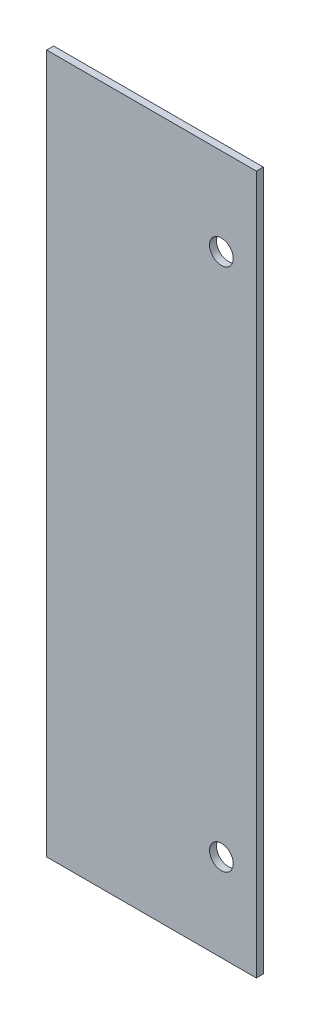
ISO-10303-21;
HEADER;
FILE_DESCRIPTION(('STEP AP214'),'2;1');
FILE_NAME('part.step','',(''),(''),'','','');
FILE_SCHEMA(('AUTOMOTIVE_DESIGN { 1 0 10303 214 1 1 1 1 }'));
ENDSEC;
DATA;
#1=APPLICATION_CONTEXT('core data for automotive mechanical design processes');
#2=APPLICATION_PROTOCOL_DEFINITION('international standard','automotive_design',2000,#1);
#3=PRODUCT_CONTEXT('',#1,'mechanical');
#4=PRODUCT('Part','Part','',(#3));
#5=PRODUCT_RELATED_PRODUCT_CATEGORY('part','',(#4));
#6=PRODUCT_DEFINITION_FORMATION('','',#4);
#7=PRODUCT_DEFINITION_CONTEXT('part definition',#1,'design');
#8=PRODUCT_DEFINITION('design','',#6,#7);
#9=PRODUCT_DEFINITION_SHAPE('','',#8);
#10=(LENGTH_UNIT() NAMED_UNIT(*) SI_UNIT(.MILLI.,.METRE.));
#11=(NAMED_UNIT(*) PLANE_ANGLE_UNIT() SI_UNIT($,.RADIAN.));
#12=(NAMED_UNIT(*) SI_UNIT($,.STERADIAN.) SOLID_ANGLE_UNIT());
#13=UNCERTAINTY_MEASURE_WITH_UNIT(LENGTH_MEASURE(1.E-05),#10,'distance_accuracy_value','');
#14=(GEOMETRIC_REPRESENTATION_CONTEXT(3) GLOBAL_UNCERTAINTY_ASSIGNED_CONTEXT((#13)) GLOBAL_UNIT_ASSIGNED_CONTEXT((#10,
#11,#12)) REPRESENTATION_CONTEXT('',''));
#15=CARTESIAN_POINT('',(0.,0.,0.));
#16=DIRECTION('',(0.,0.,1.));
#17=DIRECTION('',(1.,0.,0.));
#18=AXIS2_PLACEMENT_3D('',#15,#16,#17);
#19=CARTESIAN_POINT('',(0.,0.,0.));
#20=DIRECTION('',(0.,0.,-1.));
#21=DIRECTION('',(-1.,0.,0.));
#22=AXIS2_PLACEMENT_3D('',#19,#20,#21);
#23=PLANE('',#22);
#24=DIRECTION('',(0.,1.,0.));
#25=VECTOR('',#24,1.);
#26=CARTESIAN_POINT('',(15.,-50.,0.));
#27=LINE('',#26,#25);
#28=CARTESIAN_POINT('',(15.,-50.,0.));
#29=VERTEX_POINT('',#28);
#30=CARTESIAN_POINT('',(15.,50.,0.));
#31=VERTEX_POINT('',#30);
#32=EDGE_CURVE('E108',#29,#31,#27,.T.);
#33=ORIENTED_EDGE('',*,*,#32,.T.);
#34=DIRECTION('',(-1.,0.,0.));
#35=VECTOR('',#34,1.);
#36=CARTESIAN_POINT('',(-15.,50.,0.));
#37=LINE('',#36,#35);
#38=CARTESIAN_POINT('',(-15.,50.,0.));
#39=VERTEX_POINT('',#38);
#40=EDGE_CURVE('E115',#31,#39,#37,.T.);
#41=ORIENTED_EDGE('',*,*,#40,.T.);
#42=DIRECTION('',(0.,-1.,0.));
#43=VECTOR('',#42,1.);
#44=CARTESIAN_POINT('',(-15.,-50.,0.));
#45=LINE('',#44,#43);
#46=CARTESIAN_POINT('',(-15.,-50.,0.));
#47=VERTEX_POINT('',#46);
#48=EDGE_CURVE('E91',#39,#47,#45,.T.);
#49=ORIENTED_EDGE('',*,*,#48,.T.);
#50=DIRECTION('',(1.,0.,0.));
#51=VECTOR('',#50,1.);
#52=CARTESIAN_POINT('',(-15.,-50.,0.));
#53=LINE('',#52,#51);
#54=EDGE_CURVE('E102',#47,#29,#53,.T.);
#55=ORIENTED_EDGE('',*,*,#54,.T.);
#56=EDGE_LOOP('',(#33,#41,#49,#55));
#57=FACE_BOUND('',#56,.T.);
#58=CARTESIAN_POINT('',(10.,37.5,1.2E-05));
#59=DIRECTION('',(0.,0.,1.));
#60=DIRECTION('',(1.,0.,0.));
#61=AXIS2_PLACEMENT_3D('',#58,#59,#60);
#62=CIRCLE('',#61,1.7);
#63=CARTESIAN_POINT('',(11.7,37.5,1.2E-05));
#64=VERTEX_POINT('',#63);
#65=EDGE_CURVE('E121',#64,#64,#62,.T.);
#66=ORIENTED_EDGE('',*,*,#65,.F.);
#67=EDGE_LOOP('',(#66));
#68=FACE_BOUND('',#67,.T.);
#69=CARTESIAN_POINT('',(10.,-37.5,1.2E-05));
#70=DIRECTION('',(0.,0.,1.));
#71=DIRECTION('',(1.,0.,0.));
#72=AXIS2_PLACEMENT_3D('',#69,#70,#71);
#73=CIRCLE('',#72,1.7);
#74=CARTESIAN_POINT('',(11.7,-37.5,1.2E-05));
#75=VERTEX_POINT('',#74);
#76=EDGE_CURVE('E114',#75,#75,#73,.T.);
#77=ORIENTED_EDGE('',*,*,#76,.F.);
#78=EDGE_LOOP('',(#77));
#79=FACE_BOUND('',#78,.T.);
#80=ADVANCED_FACE('F39',(#57,#68,#79),#23,.F.);
#81=CARTESIAN_POINT('',(15.,-50.,-1.));
#82=DIRECTION('',(1.,0.,0.));
#83=DIRECTION('',(0.,0.,-1.));
#84=AXIS2_PLACEMENT_3D('',#81,#82,#83);
#85=PLANE('',#84);
#86=ORIENTED_EDGE('',*,*,#32,.F.);
#87=DIRECTION('',(0.,0.,1.));
#88=VECTOR('',#87,1.);
#89=CARTESIAN_POINT('',(15.,-50.,-1.));
#90=LINE('',#89,#88);
#91=CARTESIAN_POINT('',(15.,-50.,-1.));
#92=VERTEX_POINT('',#91);
#93=EDGE_CURVE('E11',#92,#29,#90,.T.);
#94=ORIENTED_EDGE('',*,*,#93,.F.);
#95=DIRECTION('',(0.,1.,0.));
#96=VECTOR('',#95,1.);
#97=CARTESIAN_POINT('',(15.,-50.,-1.));
#98=LINE('',#97,#96);
#99=CARTESIAN_POINT('',(15.,50.,-1.));
#100=VERTEX_POINT('',#99);
#101=EDGE_CURVE('E105',#92,#100,#98,.T.);
#102=ORIENTED_EDGE('',*,*,#101,.T.);
#103=DIRECTION('',(0.,0.,1.));
#104=VECTOR('',#103,1.);
#105=CARTESIAN_POINT('',(15.,50.,-1.));
#106=LINE('',#105,#104);
#107=EDGE_CURVE('E83',#100,#31,#106,.T.);
#108=ORIENTED_EDGE('',*,*,#107,.T.);
#109=EDGE_LOOP('',(#86,#94,#102,#108));
#110=FACE_BOUND('',#109,.T.);
#111=ADVANCED_FACE('F41',(#110),#85,.T.);
#112=CARTESIAN_POINT('',(-15.,-50.,-1.));
#113=DIRECTION('',(0.,-1.,0.));
#114=DIRECTION('',(0.,0.,-1.));
#115=AXIS2_PLACEMENT_3D('',#112,#113,#114);
#116=PLANE('',#115);
#117=ORIENTED_EDGE('',*,*,#54,.F.);
#118=DIRECTION('',(0.,0.,1.));
#119=VECTOR('',#118,1.);
#120=CARTESIAN_POINT('',(-15.,-50.,-1.));
#121=LINE('',#120,#119);
#122=CARTESIAN_POINT('',(-15.,-50.,-1.));
#123=VERTEX_POINT('',#122);
#124=EDGE_CURVE('E51',#123,#47,#121,.T.);
#125=ORIENTED_EDGE('',*,*,#124,.F.);
#126=DIRECTION('',(1.,0.,0.));
#127=VECTOR('',#126,1.);
#128=CARTESIAN_POINT('',(-15.,-50.,-1.));
#129=LINE('',#128,#127);
#130=EDGE_CURVE('E97',#123,#92,#129,.T.);
#131=ORIENTED_EDGE('',*,*,#130,.T.);
#132=ORIENTED_EDGE('',*,*,#93,.T.);
#133=EDGE_LOOP('',(#117,#125,#131,#132));
#134=FACE_BOUND('',#133,.T.);
#135=ADVANCED_FACE('F136',(#134),#116,.T.);
#136=CARTESIAN_POINT('',(-15.,-50.,-1.));
#137=DIRECTION('',(-1.,0.,0.));
#138=DIRECTION('',(0.,0.,1.));
#139=AXIS2_PLACEMENT_3D('',#136,#137,#138);
#140=PLANE('',#139);
#141=ORIENTED_EDGE('',*,*,#48,.F.);
#142=DIRECTION('',(0.,0.,1.));
#143=VECTOR('',#142,1.);
#144=CARTESIAN_POINT('',(-15.,50.,-1.));
#145=LINE('',#144,#143);
#146=CARTESIAN_POINT('',(-15.,50.,-1.));
#147=VERTEX_POINT('',#146);
#148=EDGE_CURVE('E86',#147,#39,#145,.T.);
#149=ORIENTED_EDGE('',*,*,#148,.F.);
#150=DIRECTION('',(0.,-1.,0.));
#151=VECTOR('',#150,1.);
#152=CARTESIAN_POINT('',(-15.,-50.,-1.));
#153=LINE('',#152,#151);
#154=EDGE_CURVE('E93',#147,#123,#153,.T.);
#155=ORIENTED_EDGE('',*,*,#154,.T.);
#156=ORIENTED_EDGE('',*,*,#124,.T.);
#157=EDGE_LOOP('',(#141,#149,#155,#156));
#158=FACE_BOUND('',#157,.T.);
#159=ADVANCED_FACE('F89',(#158),#140,.T.);
#160=CARTESIAN_POINT('',(-15.,50.,-1.));
#161=DIRECTION('',(0.,1.,0.));
#162=DIRECTION('',(0.,0.,1.));
#163=AXIS2_PLACEMENT_3D('',#160,#161,#162);
#164=PLANE('',#163);
#165=ORIENTED_EDGE('',*,*,#40,.F.);
#166=ORIENTED_EDGE('',*,*,#107,.F.);
#167=DIRECTION('',(-1.,0.,0.));
#168=VECTOR('',#167,1.);
#169=CARTESIAN_POINT('',(-15.,50.,-1.));
#170=LINE('',#169,#168);
#171=EDGE_CURVE('E98',#100,#147,#170,.T.);
#172=ORIENTED_EDGE('',*,*,#171,.T.);
#173=ORIENTED_EDGE('',*,*,#148,.T.);
#174=EDGE_LOOP('',(#165,#166,#172,#173));
#175=FACE_BOUND('',#174,.T.);
#176=ADVANCED_FACE('F101',(#175),#164,.T.);
#177=CARTESIAN_POINT('',(0.,0.,-1.));
#178=DIRECTION('',(0.,0.,-1.));
#179=DIRECTION('',(-1.,0.,0.));
#180=AXIS2_PLACEMENT_3D('',#177,#178,#179);
#181=PLANE('',#180);
#182=CARTESIAN_POINT('',(10.,-37.5,-1.));
#183=DIRECTION('',(0.,0.,1.));
#184=DIRECTION('',(1.,0.,0.));
#185=AXIS2_PLACEMENT_3D('',#182,#183,#184);
#186=CIRCLE('',#185,1.7);
#187=CARTESIAN_POINT('',(11.7,-37.5,-1.));
#188=VERTEX_POINT('',#187);
#189=EDGE_CURVE('E158',#188,#188,#186,.T.);
#190=ORIENTED_EDGE('',*,*,#189,.T.);
#191=EDGE_LOOP('',(#190));
#192=FACE_BOUND('',#191,.T.);
#193=CARTESIAN_POINT('',(10.,37.5,-1.));
#194=DIRECTION('',(0.,0.,1.));
#195=DIRECTION('',(1.,0.,0.));
#196=AXIS2_PLACEMENT_3D('',#193,#194,#195);
#197=CIRCLE('',#196,1.7);
#198=CARTESIAN_POINT('',(11.7,37.5,-1.));
#199=VERTEX_POINT('',#198);
#200=EDGE_CURVE('E161',#199,#199,#197,.T.);
#201=ORIENTED_EDGE('',*,*,#200,.T.);
#202=EDGE_LOOP('',(#201));
#203=FACE_BOUND('',#202,.T.);
#204=ORIENTED_EDGE('',*,*,#101,.F.);
#205=ORIENTED_EDGE('',*,*,#130,.F.);
#206=ORIENTED_EDGE('',*,*,#154,.F.);
#207=ORIENTED_EDGE('',*,*,#171,.F.);
#208=EDGE_LOOP('',(#204,#205,#206,#207));
#209=FACE_BOUND('',#208,.T.);
#210=ADVANCED_FACE('F100',(#192,#203,#209),#181,.T.);
#211=CARTESIAN_POINT('',(10.,37.5,1.2E-05));
#212=DIRECTION('',(0.,0.,-1.));
#213=DIRECTION('',(-1.,0.,0.));
#214=AXIS2_PLACEMENT_3D('',#211,#212,#213);
#215=CYLINDRICAL_SURFACE('',#214,1.7);
#216=ORIENTED_EDGE('',*,*,#65,.T.);
#217=EDGE_LOOP('',(#216));
#218=FACE_BOUND('',#217,.T.);
#219=ORIENTED_EDGE('',*,*,#200,.F.);
#220=EDGE_LOOP('',(#219));
#221=FACE_BOUND('',#220,.T.);
#222=ADVANCED_FACE('F146',(#218,#221),#215,.F.);
#223=CARTESIAN_POINT('',(10.,-37.5,1.2E-05));
#224=DIRECTION('',(0.,0.,-1.));
#225=DIRECTION('',(-1.,0.,0.));
#226=AXIS2_PLACEMENT_3D('',#223,#224,#225);
#227=CYLINDRICAL_SURFACE('',#226,1.7);
#228=ORIENTED_EDGE('',*,*,#76,.T.);
#229=EDGE_LOOP('',(#228));
#230=FACE_BOUND('',#229,.T.);
#231=ORIENTED_EDGE('',*,*,#189,.F.);
#232=EDGE_LOOP('',(#231));
#233=FACE_BOUND('',#232,.T.);
#234=ADVANCED_FACE('F153',(#230,#233),#227,.F.);
#235=CLOSED_SHELL('',(#80,#111,#135,#159,#176,#210,#222,#234));
#236=MANIFOLD_SOLID_BREP('B2',#235);
#237=ADVANCED_BREP_SHAPE_REPRESENTATION('',(#18,#236),#14);
#238=SHAPE_DEFINITION_REPRESENTATION(#9,#237);
ENDSEC;
END-ISO-10303-21;
